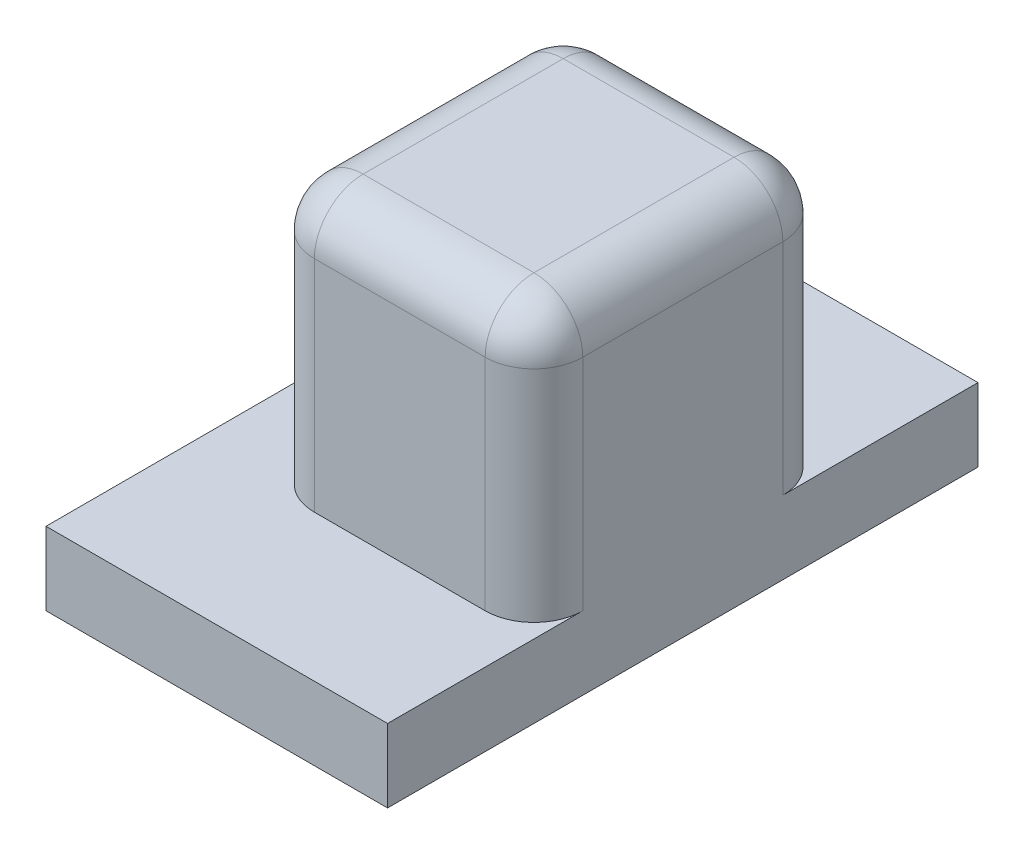
ISO-10303-21;
HEADER;
FILE_DESCRIPTION(('STEP AP214'),'2;1');
FILE_NAME('part.step','',(''),(''),'','','');
FILE_SCHEMA(('AUTOMOTIVE_DESIGN { 1 0 10303 214 1 1 1 1 }'));
ENDSEC;
DATA;
#1=APPLICATION_CONTEXT('core data for automotive mechanical design processes');
#2=APPLICATION_PROTOCOL_DEFINITION('international standard','automotive_design',2000,#1);
#3=PRODUCT_CONTEXT('',#1,'mechanical');
#4=PRODUCT('Part','Part','',(#3));
#5=PRODUCT_RELATED_PRODUCT_CATEGORY('part','',(#4));
#6=PRODUCT_DEFINITION_FORMATION('','',#4);
#7=PRODUCT_DEFINITION_CONTEXT('part definition',#1,'design');
#8=PRODUCT_DEFINITION('design','',#6,#7);
#9=PRODUCT_DEFINITION_SHAPE('','',#8);
#10=(LENGTH_UNIT() NAMED_UNIT(*) SI_UNIT(.MILLI.,.METRE.));
#11=(NAMED_UNIT(*) PLANE_ANGLE_UNIT() SI_UNIT($,.RADIAN.));
#12=(NAMED_UNIT(*) SI_UNIT($,.STERADIAN.) SOLID_ANGLE_UNIT());
#13=UNCERTAINTY_MEASURE_WITH_UNIT(LENGTH_MEASURE(1.E-05),#10,'distance_accuracy_value','');
#14=(GEOMETRIC_REPRESENTATION_CONTEXT(3) GLOBAL_UNCERTAINTY_ASSIGNED_CONTEXT((#13)) GLOBAL_UNIT_ASSIGNED_CONTEXT((#10,
#11,#12)) REPRESENTATION_CONTEXT('',''));
#15=CARTESIAN_POINT('',(0.,0.,0.));
#16=DIRECTION('',(0.,0.,1.));
#17=DIRECTION('',(1.,0.,0.));
#18=AXIS2_PLACEMENT_3D('',#15,#16,#17);
#19=CARTESIAN_POINT('',(1.2,7.,-1.4));
#20=DIRECTION('',(1.,0.,0.));
#21=DIRECTION('',(0.,0.,-1.));
#22=AXIS2_PLACEMENT_3D('',#19,#20,#21);
#23=PLANE('',#22);
#24=DIRECTION('',(0.,-1.,0.));
#25=VECTOR('',#24,1.);
#26=CARTESIAN_POINT('',(1.2,7.,-1.4));
#27=LINE('',#26,#25);
#28=CARTESIAN_POINT('',(1.2,5.5,-1.4));
#29=VERTEX_POINT('',#28);
#30=CARTESIAN_POINT('',(1.2,0.,-1.4));
#31=VERTEX_POINT('',#30);
#32=EDGE_CURVE('E254',#29,#31,#27,.T.);
#33=ORIENTED_EDGE('',*,*,#32,.T.);
#34=DIRECTION('',(0.,0.,1.));
#35=VECTOR('',#34,1.);
#36=CARTESIAN_POINT('',(1.2,0.,-1.4));
#37=LINE('',#36,#35);
#38=CARTESIAN_POINT('',(1.2,0.,-4.7));
#39=VERTEX_POINT('',#38);
#40=EDGE_CURVE('E229',#39,#31,#37,.T.);
#41=ORIENTED_EDGE('',*,*,#40,.F.);
#42=DIRECTION('',(0.,-1.,0.));
#43=VECTOR('',#42,1.);
#44=CARTESIAN_POINT('',(1.2,7.,-4.7));
#45=LINE('',#44,#43);
#46=CARTESIAN_POINT('',(1.2,5.5,-4.7));
#47=VERTEX_POINT('',#46);
#48=EDGE_CURVE('E245',#47,#39,#45,.T.);
#49=ORIENTED_EDGE('',*,*,#48,.F.);
#50=DIRECTION('',(0.,0.,1.));
#51=VECTOR('',#50,1.);
#52=CARTESIAN_POINT('',(1.2,5.5,-1.4));
#53=LINE('',#52,#51);
#54=EDGE_CURVE('E225',#47,#29,#53,.T.);
#55=ORIENTED_EDGE('',*,*,#54,.T.);
#56=EDGE_LOOP('',(#33,#41,#49,#55));
#57=FACE_BOUND('',#56,.T.);
#58=ADVANCED_FACE('F45',(#57),#23,.T.);
#59=CARTESIAN_POINT('',(1.2,7.,-1.4));
#60=DIRECTION('',(0.,0.,-1.));
#61=DIRECTION('',(-1.,0.,0.));
#62=AXIS2_PLACEMENT_3D('',#59,#60,#61);
#63=PLANE('',#62);
#64=DIRECTION('',(0.,-1.,0.));
#65=VECTOR('',#64,1.);
#66=CARTESIAN_POINT('',(4.5,7.,-1.4));
#67=LINE('',#66,#65);
#68=CARTESIAN_POINT('',(4.5,5.5,-1.4));
#69=VERTEX_POINT('',#68);
#70=CARTESIAN_POINT('',(4.5,0.,-1.4));
#71=VERTEX_POINT('',#70);
#72=EDGE_CURVE('E251',#69,#71,#67,.T.);
#73=ORIENTED_EDGE('',*,*,#72,.T.);
#74=DIRECTION('',(1.,0.,0.));
#75=VECTOR('',#74,1.);
#76=CARTESIAN_POINT('',(1.2,0.,-1.4));
#77=LINE('',#76,#75);
#78=EDGE_CURVE('E233',#31,#71,#77,.T.);
#79=ORIENTED_EDGE('',*,*,#78,.F.);
#80=ORIENTED_EDGE('',*,*,#32,.F.);
#81=DIRECTION('',(1.,0.,0.));
#82=VECTOR('',#81,1.);
#83=CARTESIAN_POINT('',(1.2,5.5,-1.4));
#84=LINE('',#83,#82);
#85=EDGE_CURVE('E221',#29,#69,#84,.T.);
#86=ORIENTED_EDGE('',*,*,#85,.T.);
#87=EDGE_LOOP('',(#73,#79,#80,#86));
#88=FACE_BOUND('',#87,.T.);
#89=ADVANCED_FACE('F456',(#88),#63,.T.);
#90=CARTESIAN_POINT('',(4.5,7.,-1.4));
#91=DIRECTION('',(-1.,0.,0.));
#92=DIRECTION('',(0.,0.,1.));
#93=AXIS2_PLACEMENT_3D('',#90,#91,#92);
#94=PLANE('',#93);
#95=DIRECTION('',(0.,-1.,0.));
#96=VECTOR('',#95,1.);
#97=CARTESIAN_POINT('',(4.5,7.,-4.7));
#98=LINE('',#97,#96);
#99=CARTESIAN_POINT('',(4.5,5.5,-4.7));
#100=VERTEX_POINT('',#99);
#101=CARTESIAN_POINT('',(4.5,0.,-4.7));
#102=VERTEX_POINT('',#101);
#103=EDGE_CURVE('E248',#100,#102,#98,.T.);
#104=ORIENTED_EDGE('',*,*,#103,.T.);
#105=DIRECTION('',(0.,0.,-1.));
#106=VECTOR('',#105,1.);
#107=CARTESIAN_POINT('',(4.5,0.,-1.4));
#108=LINE('',#107,#106);
#109=EDGE_CURVE('E237',#71,#102,#108,.T.);
#110=ORIENTED_EDGE('',*,*,#109,.F.);
#111=ORIENTED_EDGE('',*,*,#72,.F.);
#112=DIRECTION('',(0.,0.,-1.));
#113=VECTOR('',#112,1.);
#114=CARTESIAN_POINT('',(4.5,5.5,-1.4));
#115=LINE('',#114,#113);
#116=EDGE_CURVE('E217',#69,#100,#115,.T.);
#117=ORIENTED_EDGE('',*,*,#116,.T.);
#118=EDGE_LOOP('',(#104,#110,#111,#117));
#119=FACE_BOUND('',#118,.T.);
#120=ADVANCED_FACE('F463',(#119),#94,.T.);
#121=CARTESIAN_POINT('',(1.2,7.,-4.7));
#122=DIRECTION('',(0.,0.,1.));
#123=DIRECTION('',(1.,0.,0.));
#124=AXIS2_PLACEMENT_3D('',#121,#122,#123);
#125=PLANE('',#124);
#126=ORIENTED_EDGE('',*,*,#48,.T.);
#127=DIRECTION('',(-1.,0.,0.));
#128=VECTOR('',#127,1.);
#129=CARTESIAN_POINT('',(1.2,0.,-4.7));
#130=LINE('',#129,#128);
#131=EDGE_CURVE('E241',#102,#39,#130,.T.);
#132=ORIENTED_EDGE('',*,*,#131,.F.);
#133=ORIENTED_EDGE('',*,*,#103,.F.);
#134=DIRECTION('',(-1.,0.,0.));
#135=VECTOR('',#134,1.);
#136=CARTESIAN_POINT('',(1.2,5.5,-4.7));
#137=LINE('',#136,#135);
#138=EDGE_CURVE('E260',#100,#47,#137,.T.);
#139=ORIENTED_EDGE('',*,*,#138,.T.);
#140=EDGE_LOOP('',(#126,#132,#133,#139));
#141=FACE_BOUND('',#140,.T.);
#142=ADVANCED_FACE('F470',(#141),#125,.T.);
#143=CARTESIAN_POINT('',(0.,7.,0.));
#144=DIRECTION('',(0.,-1.,0.));
#145=DIRECTION('',(0.,0.,-1.));
#146=AXIS2_PLACEMENT_3D('',#143,#144,#145);
#147=PLANE('',#146);
#148=DIRECTION('',(0.,0.,-1.));
#149=VECTOR('',#148,1.);
#150=CARTESIAN_POINT('',(4.5,7.,0.));
#151=LINE('',#150,#149);
#152=CARTESIAN_POINT('',(4.5,7.,-1.));
#153=VERTEX_POINT('',#152);
#154=CARTESIAN_POINT('',(4.5,7.,-5.1));
#155=VERTEX_POINT('',#154);
#156=EDGE_CURVE('E312',#153,#155,#151,.T.);
#157=ORIENTED_EDGE('',*,*,#156,.T.);
#158=DIRECTION('',(-1.,0.,0.));
#159=VECTOR('',#158,1.);
#160=CARTESIAN_POINT('',(0.,7.,-5.1));
#161=LINE('',#160,#159);
#162=CARTESIAN_POINT('',(1.,7.,-5.1));
#163=VERTEX_POINT('',#162);
#164=EDGE_CURVE('E63',#155,#163,#161,.T.);
#165=ORIENTED_EDGE('',*,*,#164,.T.);
#166=DIRECTION('',(0.,0.,1.));
#167=VECTOR('',#166,1.);
#168=CARTESIAN_POINT('',(1.,7.,0.));
#169=LINE('',#168,#167);
#170=CARTESIAN_POINT('',(1.,7.,-1.));
#171=VERTEX_POINT('',#170);
#172=EDGE_CURVE('E309',#163,#171,#169,.T.);
#173=ORIENTED_EDGE('',*,*,#172,.T.);
#174=DIRECTION('',(1.,0.,0.));
#175=VECTOR('',#174,1.);
#176=CARTESIAN_POINT('',(0.,7.,-1.));
#177=LINE('',#176,#175);
#178=EDGE_CURVE('E306',#171,#153,#177,.T.);
#179=ORIENTED_EDGE('',*,*,#178,.T.);
#180=EDGE_LOOP('',(#157,#165,#173,#179));
#181=FACE_BOUND('',#180,.T.);
#182=ADVANCED_FACE('F443',(#181),#147,.F.);
#183=CARTESIAN_POINT('',(0.,0.,0.));
#184=DIRECTION('',(0.,-1.,0.));
#185=DIRECTION('',(0.,0.,-1.));
#186=AXIS2_PLACEMENT_3D('',#183,#184,#185);
#187=PLANE('',#186);
#188=DIRECTION('',(0.,0.,-1.));
#189=VECTOR('',#188,1.);
#190=CARTESIAN_POINT('',(5.5,0.,0.));
#191=LINE('',#190,#189);
#192=CARTESIAN_POINT('',(5.5,0.,3.));
#193=VERTEX_POINT('',#192);
#194=CARTESIAN_POINT('',(5.5,0.,-9.1));
#195=VERTEX_POINT('',#194);
#196=EDGE_CURVE('E257',#193,#195,#191,.T.);
#197=ORIENTED_EDGE('',*,*,#196,.F.);
#198=DIRECTION('',(1.,0.,0.));
#199=VECTOR('',#198,1.);
#200=CARTESIAN_POINT('',(-1.5,0.,3.));
#201=LINE('',#200,#199);
#202=CARTESIAN_POINT('',(-1.5,0.,3.));
#203=VERTEX_POINT('',#202);
#204=EDGE_CURVE('E376',#203,#193,#201,.T.);
#205=ORIENTED_EDGE('',*,*,#204,.F.);
#206=DIRECTION('',(0.,0.,1.));
#207=VECTOR('',#206,1.);
#208=CARTESIAN_POINT('',(-1.5,0.,-9.1));
#209=LINE('',#208,#207);
#210=CARTESIAN_POINT('',(-1.5,0.,-9.1));
#211=VERTEX_POINT('',#210);
#212=EDGE_CURVE('E201',#211,#203,#209,.T.);
#213=ORIENTED_EDGE('',*,*,#212,.F.);
#214=DIRECTION('',(-1.,0.,0.));
#215=VECTOR('',#214,1.);
#216=CARTESIAN_POINT('',(-1.5,0.,-9.1));
#217=LINE('',#216,#215);
#218=EDGE_CURVE('E197',#195,#211,#217,.T.);
#219=ORIENTED_EDGE('',*,*,#218,.F.);
#220=EDGE_LOOP('',(#197,#205,#213,#219));
#221=FACE_BOUND('',#220,.T.);
#222=ORIENTED_EDGE('',*,*,#131,.T.);
#223=ORIENTED_EDGE('',*,*,#40,.T.);
#224=ORIENTED_EDGE('',*,*,#78,.T.);
#225=ORIENTED_EDGE('',*,*,#109,.T.);
#226=EDGE_LOOP('',(#222,#223,#224,#225));
#227=FACE_BOUND('',#226,.T.);
#228=ADVANCED_FACE('F395',(#221,#227),#187,.T.);
#229=CARTESIAN_POINT('',(0.,7.,0.));
#230=DIRECTION('',(1.,0.,0.));
#231=DIRECTION('',(0.,0.,-1.));
#232=AXIS2_PLACEMENT_3D('',#229,#230,#231);
#233=PLANE('',#232);
#234=DIRECTION('',(0.,0.,1.));
#235=VECTOR('',#234,1.);
#236=CARTESIAN_POINT('',(0.,6.,0.));
#237=LINE('',#236,#235);
#238=CARTESIAN_POINT('',(0.,6.,-1.));
#239=VERTEX_POINT('',#238);
#240=CARTESIAN_POINT('',(0.,6.,-5.1));
#241=VERTEX_POINT('',#240);
#242=EDGE_CURVE('E268',#239,#241,#237,.F.);
#243=ORIENTED_EDGE('',*,*,#242,.T.);
#244=DIRECTION('',(0.,-1.,0.));
#245=VECTOR('',#244,1.);
#246=CARTESIAN_POINT('',(0.,7.,-5.1));
#247=LINE('',#246,#245);
#248=CARTESIAN_POINT('',(0.,1.5,-5.1));
#249=VERTEX_POINT('',#248);
#250=EDGE_CURVE('E274',#241,#249,#247,.T.);
#251=ORIENTED_EDGE('',*,*,#250,.T.);
#252=DIRECTION('',(0.,0.,1.));
#253=VECTOR('',#252,1.);
#254=CARTESIAN_POINT('',(0.,1.5,0.));
#255=LINE('',#254,#253);
#256=CARTESIAN_POINT('',(0.,1.5,-1.));
#257=VERTEX_POINT('',#256);
#258=EDGE_CURVE('E203',#249,#257,#255,.T.);
#259=ORIENTED_EDGE('',*,*,#258,.T.);
#260=DIRECTION('',(0.,-1.,0.));
#261=VECTOR('',#260,1.);
#262=CARTESIAN_POINT('',(0.,7.,-1.));
#263=LINE('',#262,#261);
#264=EDGE_CURVE('E271',#257,#239,#263,.F.);
#265=ORIENTED_EDGE('',*,*,#264,.T.);
#266=EDGE_LOOP('',(#243,#251,#259,#265));
#267=FACE_BOUND('',#266,.T.);
#268=ADVANCED_FACE('F428',(#267),#233,.F.);
#269=CARTESIAN_POINT('',(0.,7.,0.));
#270=DIRECTION('',(0.,0.,-1.));
#271=DIRECTION('',(-1.,0.,0.));
#272=AXIS2_PLACEMENT_3D('',#269,#270,#271);
#273=PLANE('',#272);
#274=DIRECTION('',(1.,0.,0.));
#275=VECTOR('',#274,1.);
#276=CARTESIAN_POINT('',(0.,6.,0.));
#277=LINE('',#276,#275);
#278=CARTESIAN_POINT('',(4.5,6.,0.));
#279=VERTEX_POINT('',#278);
#280=CARTESIAN_POINT('',(1.,6.,0.));
#281=VERTEX_POINT('',#280);
#282=EDGE_CURVE('E287',#279,#281,#277,.F.);
#283=ORIENTED_EDGE('',*,*,#282,.T.);
#284=DIRECTION('',(0.,-1.,0.));
#285=VECTOR('',#284,1.);
#286=CARTESIAN_POINT('',(1.,7.,0.));
#287=LINE('',#286,#285);
#288=CARTESIAN_POINT('',(1.,1.5,0.));
#289=VERTEX_POINT('',#288);
#290=EDGE_CURVE('E293',#281,#289,#287,.T.);
#291=ORIENTED_EDGE('',*,*,#290,.T.);
#292=DIRECTION('',(1.,0.,0.));
#293=VECTOR('',#292,1.);
#294=CARTESIAN_POINT('',(0.,1.5,0.));
#295=LINE('',#294,#293);
#296=CARTESIAN_POINT('',(4.5,1.5,0.));
#297=VERTEX_POINT('',#296);
#298=EDGE_CURVE('E208',#289,#297,#295,.T.);
#299=ORIENTED_EDGE('',*,*,#298,.T.);
#300=DIRECTION('',(0.,-1.,0.));
#301=VECTOR('',#300,1.);
#302=CARTESIAN_POINT('',(4.5,7.,0.));
#303=LINE('',#302,#301);
#304=EDGE_CURVE('E290',#297,#279,#303,.F.);
#305=ORIENTED_EDGE('',*,*,#304,.T.);
#306=EDGE_LOOP('',(#283,#291,#299,#305));
#307=FACE_BOUND('',#306,.T.);
#308=ADVANCED_FACE('F479',(#307),#273,.F.);
#309=CARTESIAN_POINT('',(5.5,7.,0.));
#310=DIRECTION('',(-1.,0.,0.));
#311=DIRECTION('',(0.,0.,1.));
#312=AXIS2_PLACEMENT_3D('',#309,#310,#311);
#313=PLANE('',#312);
#314=DIRECTION('',(0.,-1.,0.));
#315=VECTOR('',#314,1.);
#316=CARTESIAN_POINT('',(5.5,7.,-1.));
#317=LINE('',#316,#315);
#318=CARTESIAN_POINT('',(5.5,6.,-1.));
#319=VERTEX_POINT('',#318);
#320=CARTESIAN_POINT('',(5.5,1.5,-1.));
#321=VERTEX_POINT('',#320);
#322=EDGE_CURVE('E302',#319,#321,#317,.T.);
#323=ORIENTED_EDGE('',*,*,#322,.T.);
#324=DIRECTION('',(0.,0.,-1.));
#325=VECTOR('',#324,1.);
#326=CARTESIAN_POINT('',(5.5,1.5,-9.1));
#327=LINE('',#326,#325);
#328=CARTESIAN_POINT('',(5.5,1.5,3.));
#329=VERTEX_POINT('',#328);
#330=EDGE_CURVE('E398',#329,#321,#327,.T.);
#331=ORIENTED_EDGE('',*,*,#330,.F.);
#332=DIRECTION('',(0.,-1.,0.));
#333=VECTOR('',#332,1.);
#334=CARTESIAN_POINT('',(5.5,1.5,3.));
#335=LINE('',#334,#333);
#336=EDGE_CURVE('E181',#329,#193,#335,.T.);
#337=ORIENTED_EDGE('',*,*,#336,.T.);
#338=ORIENTED_EDGE('',*,*,#196,.T.);
#339=DIRECTION('',(0.,-1.,0.));
#340=VECTOR('',#339,1.);
#341=CARTESIAN_POINT('',(5.5,1.5,-9.1));
#342=LINE('',#341,#340);
#343=CARTESIAN_POINT('',(5.5,1.5,-9.1));
#344=VERTEX_POINT('',#343);
#345=EDGE_CURVE('E210',#344,#195,#342,.T.);
#346=ORIENTED_EDGE('',*,*,#345,.F.);
#347=CARTESIAN_POINT('',(5.5,1.5,-5.1));
#348=VERTEX_POINT('',#347);
#349=EDGE_CURVE('E185',#348,#344,#327,.T.);
#350=ORIENTED_EDGE('',*,*,#349,.F.);
#351=DIRECTION('',(0.,-1.,0.));
#352=VECTOR('',#351,1.);
#353=CARTESIAN_POINT('',(5.5,7.,-5.1));
#354=LINE('',#353,#352);
#355=CARTESIAN_POINT('',(5.5,6.,-5.1));
#356=VERTEX_POINT('',#355);
#357=EDGE_CURVE('E299',#348,#356,#354,.F.);
#358=ORIENTED_EDGE('',*,*,#357,.T.);
#359=DIRECTION('',(0.,0.,-1.));
#360=VECTOR('',#359,1.);
#361=CARTESIAN_POINT('',(5.5,6.,0.));
#362=LINE('',#361,#360);
#363=EDGE_CURVE('E296',#356,#319,#362,.F.);
#364=ORIENTED_EDGE('',*,*,#363,.T.);
#365=EDGE_LOOP('',(#323,#331,#337,#338,#346,#350,#358,#364));
#366=FACE_BOUND('',#365,.T.);
#367=ADVANCED_FACE('F397',(#366),#313,.F.);
#368=CARTESIAN_POINT('',(0.,7.,-6.1));
#369=DIRECTION('',(0.,0.,1.));
#370=DIRECTION('',(1.,0.,0.));
#371=AXIS2_PLACEMENT_3D('',#368,#369,#370);
#372=PLANE('',#371);
#373=DIRECTION('',(-1.,0.,0.));
#374=VECTOR('',#373,1.);
#375=CARTESIAN_POINT('',(0.,1.5,-6.1));
#376=LINE('',#375,#374);
#377=CARTESIAN_POINT('',(4.5,1.5,-6.1));
#378=VERTEX_POINT('',#377);
#379=CARTESIAN_POINT('',(1.,1.5,-6.1));
#380=VERTEX_POINT('',#379);
#381=EDGE_CURVE('E264',#378,#380,#376,.T.);
#382=ORIENTED_EDGE('',*,*,#381,.T.);
#383=DIRECTION('',(0.,-1.,0.));
#384=VECTOR('',#383,1.);
#385=CARTESIAN_POINT('',(1.,7.,-6.1));
#386=LINE('',#385,#384);
#387=CARTESIAN_POINT('',(1.,6.,-6.1));
#388=VERTEX_POINT('',#387);
#389=EDGE_CURVE('E284',#380,#388,#386,.F.);
#390=ORIENTED_EDGE('',*,*,#389,.T.);
#391=DIRECTION('',(-1.,0.,0.));
#392=VECTOR('',#391,1.);
#393=CARTESIAN_POINT('',(0.,6.,-6.1));
#394=LINE('',#393,#392);
#395=CARTESIAN_POINT('',(4.5,6.,-6.1));
#396=VERTEX_POINT('',#395);
#397=EDGE_CURVE('E278',#388,#396,#394,.F.);
#398=ORIENTED_EDGE('',*,*,#397,.T.);
#399=DIRECTION('',(0.,-1.,0.));
#400=VECTOR('',#399,1.);
#401=CARTESIAN_POINT('',(4.5,7.,-6.1));
#402=LINE('',#401,#400);
#403=EDGE_CURVE('E281',#396,#378,#402,.T.);
#404=ORIENTED_EDGE('',*,*,#403,.T.);
#405=EDGE_LOOP('',(#382,#390,#398,#404));
#406=FACE_BOUND('',#405,.T.);
#407=ADVANCED_FACE('F473',(#406),#372,.F.);
#408=CARTESIAN_POINT('',(0.,5.5,0.));
#409=DIRECTION('',(0.,1.,0.));
#410=DIRECTION('',(0.,0.,1.));
#411=AXIS2_PLACEMENT_3D('',#408,#409,#410);
#412=PLANE('',#411);
#413=ORIENTED_EDGE('',*,*,#54,.F.);
#414=ORIENTED_EDGE('',*,*,#138,.F.);
#415=ORIENTED_EDGE('',*,*,#116,.F.);
#416=ORIENTED_EDGE('',*,*,#85,.F.);
#417=EDGE_LOOP('',(#413,#414,#415,#416));
#418=FACE_BOUND('',#417,.T.);
#419=ADVANCED_FACE('F476',(#418),#412,.F.);
#420=CARTESIAN_POINT('',(0.,1.5,0.));
#421=DIRECTION('',(0.,1.,0.));
#422=DIRECTION('',(0.,0.,1.));
#423=AXIS2_PLACEMENT_3D('',#420,#421,#422);
#424=PLANE('',#423);
#425=ORIENTED_EDGE('',*,*,#298,.F.);
#426=CARTESIAN_POINT('',(1.,1.5,-1.));
#427=DIRECTION('',(0.,1.,0.));
#428=DIRECTION('',(0.,0.,1.));
#429=AXIS2_PLACEMENT_3D('',#426,#427,#428);
#430=CIRCLE('',#429,1.);
#431=EDGE_CURVE('E320',#289,#257,#430,.F.);
#432=ORIENTED_EDGE('',*,*,#431,.T.);
#433=ORIENTED_EDGE('',*,*,#258,.F.);
#434=CARTESIAN_POINT('',(1.,1.5,-5.1));
#435=DIRECTION('',(0.,1.,0.));
#436=DIRECTION('',(0.,0.,1.));
#437=AXIS2_PLACEMENT_3D('',#434,#435,#436);
#438=CIRCLE('',#437,1.);
#439=EDGE_CURVE('E317',#249,#380,#438,.F.);
#440=ORIENTED_EDGE('',*,*,#439,.T.);
#441=ORIENTED_EDGE('',*,*,#381,.F.);
#442=CARTESIAN_POINT('',(4.5,1.5,-5.1));
#443=DIRECTION('',(0.,1.,0.));
#444=DIRECTION('',(0.,0.,1.));
#445=AXIS2_PLACEMENT_3D('',#442,#443,#444);
#446=CIRCLE('',#445,1.);
#447=EDGE_CURVE('E11',#378,#348,#446,.F.);
#448=ORIENTED_EDGE('',*,*,#447,.T.);
#449=ORIENTED_EDGE('',*,*,#349,.T.);
#450=DIRECTION('',(-1.,0.,0.));
#451=VECTOR('',#450,1.);
#452=CARTESIAN_POINT('',(-1.5,1.5,-9.1));
#453=LINE('',#452,#451);
#454=CARTESIAN_POINT('',(-1.5,1.5,-9.1));
#455=VERTEX_POINT('',#454);
#456=EDGE_CURVE('E192',#344,#455,#453,.T.);
#457=ORIENTED_EDGE('',*,*,#456,.T.);
#458=DIRECTION('',(0.,0.,1.));
#459=VECTOR('',#458,1.);
#460=CARTESIAN_POINT('',(-1.5,1.5,-9.1));
#461=LINE('',#460,#459);
#462=CARTESIAN_POINT('',(-1.5,1.5,3.));
#463=VERTEX_POINT('',#462);
#464=EDGE_CURVE('E186',#455,#463,#461,.T.);
#465=ORIENTED_EDGE('',*,*,#464,.T.);
#466=DIRECTION('',(1.,0.,0.));
#467=VECTOR('',#466,1.);
#468=CARTESIAN_POINT('',(-1.5,1.5,3.));
#469=LINE('',#468,#467);
#470=EDGE_CURVE('E173',#463,#329,#469,.T.);
#471=ORIENTED_EDGE('',*,*,#470,.T.);
#472=ORIENTED_EDGE('',*,*,#330,.T.);
#473=CARTESIAN_POINT('',(4.5,1.5,-1.));
#474=DIRECTION('',(0.,1.,0.));
#475=DIRECTION('',(0.,0.,1.));
#476=AXIS2_PLACEMENT_3D('',#473,#474,#475);
#477=CIRCLE('',#476,1.);
#478=EDGE_CURVE('E55',#321,#297,#477,.F.);
#479=ORIENTED_EDGE('',*,*,#478,.T.);
#480=EDGE_LOOP('',(#425,#432,#433,#440,#441,#448,#449,#457,#465,#471,#472,#479));
#481=FACE_BOUND('',#480,.T.);
#482=ADVANCED_FACE('F190',(#481),#424,.T.);
#483=CARTESIAN_POINT('',(-1.5,1.5,-9.1));
#484=DIRECTION('',(1.,0.,0.));
#485=DIRECTION('',(0.,0.,-1.));
#486=AXIS2_PLACEMENT_3D('',#483,#484,#485);
#487=PLANE('',#486);
#488=ORIENTED_EDGE('',*,*,#212,.T.);
#489=DIRECTION('',(0.,-1.,0.));
#490=VECTOR('',#489,1.);
#491=CARTESIAN_POINT('',(-1.5,1.5,3.));
#492=LINE('',#491,#490);
#493=EDGE_CURVE('E178',#463,#203,#492,.T.);
#494=ORIENTED_EDGE('',*,*,#493,.F.);
#495=ORIENTED_EDGE('',*,*,#464,.F.);
#496=DIRECTION('',(0.,-1.,0.));
#497=VECTOR('',#496,1.);
#498=CARTESIAN_POINT('',(-1.5,1.5,-9.1));
#499=LINE('',#498,#497);
#500=EDGE_CURVE('E385',#455,#211,#499,.T.);
#501=ORIENTED_EDGE('',*,*,#500,.T.);
#502=EDGE_LOOP('',(#488,#494,#495,#501));
#503=FACE_BOUND('',#502,.T.);
#504=ADVANCED_FACE('F199',(#503),#487,.F.);
#505=CARTESIAN_POINT('',(-1.5,1.5,3.));
#506=DIRECTION('',(0.,0.,-1.));
#507=DIRECTION('',(-1.,0.,0.));
#508=AXIS2_PLACEMENT_3D('',#505,#506,#507);
#509=PLANE('',#508);
#510=ORIENTED_EDGE('',*,*,#204,.T.);
#511=ORIENTED_EDGE('',*,*,#336,.F.);
#512=ORIENTED_EDGE('',*,*,#470,.F.);
#513=ORIENTED_EDGE('',*,*,#493,.T.);
#514=EDGE_LOOP('',(#510,#511,#512,#513));
#515=FACE_BOUND('',#514,.T.);
#516=ADVANCED_FACE('F176',(#515),#509,.F.);
#517=CARTESIAN_POINT('',(-1.5,1.5,-9.1));
#518=DIRECTION('',(0.,0.,1.));
#519=DIRECTION('',(1.,0.,0.));
#520=AXIS2_PLACEMENT_3D('',#517,#518,#519);
#521=PLANE('',#520);
#522=ORIENTED_EDGE('',*,*,#218,.T.);
#523=ORIENTED_EDGE('',*,*,#500,.F.);
#524=ORIENTED_EDGE('',*,*,#456,.F.);
#525=ORIENTED_EDGE('',*,*,#345,.T.);
#526=EDGE_LOOP('',(#522,#523,#524,#525));
#527=FACE_BOUND('',#526,.T.);
#528=ADVANCED_FACE('F392',(#527),#521,.F.);
#529=CARTESIAN_POINT('',(4.5,7.,-1.));
#530=DIRECTION('',(0.,-1.,0.));
#531=DIRECTION('',(0.,0.,-1.));
#532=AXIS2_PLACEMENT_3D('',#529,#530,#531);
#533=CYLINDRICAL_SURFACE('',#532,1.);
#534=CARTESIAN_POINT('',(4.5,6.,-1.));
#535=DIRECTION('',(0.,1.,0.));
#536=DIRECTION('',(0.,0.,1.));
#537=AXIS2_PLACEMENT_3D('',#534,#535,#536);
#538=CIRCLE('',#537,1.);
#539=EDGE_CURVE('E49',#279,#319,#538,.T.);
#540=ORIENTED_EDGE('',*,*,#539,.F.);
#541=ORIENTED_EDGE('',*,*,#304,.F.);
#542=ORIENTED_EDGE('',*,*,#478,.F.);
#543=ORIENTED_EDGE('',*,*,#322,.F.);
#544=EDGE_LOOP('',(#540,#541,#542,#543));
#545=FACE_BOUND('',#544,.T.);
#546=ADVANCED_FACE('F47',(#545),#533,.T.);
#547=CARTESIAN_POINT('',(4.5,6.,-1.));
#548=DIRECTION('',(1.,0.,0.));
#549=DIRECTION('',(0.,0.,-1.));
#550=AXIS2_PLACEMENT_3D('',#547,#548,#549);
#551=SPHERICAL_SURFACE('',#550,1.);
#552=CARTESIAN_POINT('',(4.5,6.,-1.));
#553=DIRECTION('',(1.,0.,0.));
#554=DIRECTION('',(0.,0.,-1.));
#555=AXIS2_PLACEMENT_3D('',#552,#553,#554);
#556=CIRCLE('',#555,1.);
#557=EDGE_CURVE('E360',#279,#153,#556,.F.);
#558=ORIENTED_EDGE('',*,*,#557,.F.);
#559=ORIENTED_EDGE('',*,*,#539,.T.);
#560=CARTESIAN_POINT('',(4.5,6.,-1.));
#561=DIRECTION('',(0.,0.,1.));
#562=DIRECTION('',(1.,0.,0.));
#563=AXIS2_PLACEMENT_3D('',#560,#561,#562);
#564=CIRCLE('',#563,1.);
#565=EDGE_CURVE('E363',#153,#319,#564,.F.);
#566=ORIENTED_EDGE('',*,*,#565,.F.);
#567=EDGE_LOOP('',(#558,#559,#566));
#568=FACE_BOUND('',#567,.T.);
#569=ADVANCED_FACE('F447',(#568),#551,.T.);
#570=CARTESIAN_POINT('',(4.5,7.,-5.1));
#571=DIRECTION('',(0.,-1.,0.));
#572=DIRECTION('',(0.,0.,-1.));
#573=AXIS2_PLACEMENT_3D('',#570,#571,#572);
#574=CYLINDRICAL_SURFACE('',#573,1.);
#575=ORIENTED_EDGE('',*,*,#447,.F.);
#576=ORIENTED_EDGE('',*,*,#403,.F.);
#577=CARTESIAN_POINT('',(4.5,6.,-5.1));
#578=DIRECTION('',(0.,1.,0.));
#579=DIRECTION('',(0.,0.,1.));
#580=AXIS2_PLACEMENT_3D('',#577,#578,#579);
#581=CIRCLE('',#580,1.);
#582=EDGE_CURVE('E356',#356,#396,#581,.T.);
#583=ORIENTED_EDGE('',*,*,#582,.F.);
#584=ORIENTED_EDGE('',*,*,#357,.F.);
#585=EDGE_LOOP('',(#575,#576,#583,#584));
#586=FACE_BOUND('',#585,.T.);
#587=ADVANCED_FACE('F412',(#586),#574,.T.);
#588=CARTESIAN_POINT('',(4.5,6.,0.));
#589=DIRECTION('',(0.,0.,-1.));
#590=DIRECTION('',(-1.,0.,0.));
#591=AXIS2_PLACEMENT_3D('',#588,#589,#590);
#592=CYLINDRICAL_SURFACE('',#591,1.);
#593=ORIENTED_EDGE('',*,*,#565,.T.);
#594=ORIENTED_EDGE('',*,*,#363,.F.);
#595=CARTESIAN_POINT('',(4.5,6.,-5.1));
#596=DIRECTION('',(0.,0.,-1.));
#597=DIRECTION('',(-1.,0.,0.));
#598=AXIS2_PLACEMENT_3D('',#595,#596,#597);
#599=CIRCLE('',#598,1.);
#600=EDGE_CURVE('E352',#155,#356,#599,.T.);
#601=ORIENTED_EDGE('',*,*,#600,.F.);
#602=ORIENTED_EDGE('',*,*,#156,.F.);
#603=EDGE_LOOP('',(#593,#594,#601,#602));
#604=FACE_BOUND('',#603,.T.);
#605=ADVANCED_FACE('F410',(#604),#592,.T.);
#606=CARTESIAN_POINT('',(0.,6.,-1.));
#607=DIRECTION('',(1.,0.,0.));
#608=DIRECTION('',(0.,0.,-1.));
#609=AXIS2_PLACEMENT_3D('',#606,#607,#608);
#610=CYLINDRICAL_SURFACE('',#609,1.);
#611=ORIENTED_EDGE('',*,*,#557,.T.);
#612=ORIENTED_EDGE('',*,*,#178,.F.);
#613=CARTESIAN_POINT('',(1.,6.,-1.));
#614=DIRECTION('',(-1.,0.,0.));
#615=DIRECTION('',(0.,0.,1.));
#616=AXIS2_PLACEMENT_3D('',#613,#614,#615);
#617=CIRCLE('',#616,1.);
#618=EDGE_CURVE('E348',#281,#171,#617,.T.);
#619=ORIENTED_EDGE('',*,*,#618,.F.);
#620=ORIENTED_EDGE('',*,*,#282,.F.);
#621=EDGE_LOOP('',(#611,#612,#619,#620));
#622=FACE_BOUND('',#621,.T.);
#623=ADVANCED_FACE('F445',(#622),#610,.T.);
#624=CARTESIAN_POINT('',(1.,7.,-1.));
#625=DIRECTION('',(0.,-1.,0.));
#626=DIRECTION('',(0.,0.,-1.));
#627=AXIS2_PLACEMENT_3D('',#624,#625,#626);
#628=CYLINDRICAL_SURFACE('',#627,1.);
#629=ORIENTED_EDGE('',*,*,#431,.F.);
#630=ORIENTED_EDGE('',*,*,#290,.F.);
#631=CARTESIAN_POINT('',(1.,6.,-1.));
#632=DIRECTION('',(0.,1.,0.));
#633=DIRECTION('',(0.,0.,1.));
#634=AXIS2_PLACEMENT_3D('',#631,#632,#633);
#635=CIRCLE('',#634,1.);
#636=EDGE_CURVE('E344',#239,#281,#635,.T.);
#637=ORIENTED_EDGE('',*,*,#636,.F.);
#638=ORIENTED_EDGE('',*,*,#264,.F.);
#639=EDGE_LOOP('',(#629,#630,#637,#638));
#640=FACE_BOUND('',#639,.T.);
#641=ADVANCED_FACE('F434',(#640),#628,.T.);
#642=CARTESIAN_POINT('',(4.5,6.,-5.1));
#643=DIRECTION('',(1.,0.,0.));
#644=DIRECTION('',(0.,0.,-1.));
#645=AXIS2_PLACEMENT_3D('',#642,#643,#644);
#646=SPHERICAL_SURFACE('',#645,1.);
#647=ORIENTED_EDGE('',*,*,#600,.T.);
#648=ORIENTED_EDGE('',*,*,#582,.T.);
#649=CARTESIAN_POINT('',(4.5,6.,-5.1));
#650=DIRECTION('',(1.,0.,0.));
#651=DIRECTION('',(0.,0.,-1.));
#652=AXIS2_PLACEMENT_3D('',#649,#650,#651);
#653=CIRCLE('',#652,1.);
#654=EDGE_CURVE('E341',#155,#396,#653,.F.);
#655=ORIENTED_EDGE('',*,*,#654,.F.);
#656=EDGE_LOOP('',(#647,#648,#655));
#657=FACE_BOUND('',#656,.T.);
#658=ADVANCED_FACE('F414',(#657),#646,.T.);
#659=CARTESIAN_POINT('',(1.,6.,-1.));
#660=DIRECTION('',(0.,0.,1.));
#661=DIRECTION('',(1.,0.,0.));
#662=AXIS2_PLACEMENT_3D('',#659,#660,#661);
#663=SPHERICAL_SURFACE('',#662,1.);
#664=ORIENTED_EDGE('',*,*,#636,.T.);
#665=ORIENTED_EDGE('',*,*,#618,.T.);
#666=CARTESIAN_POINT('',(1.,6.,-1.));
#667=DIRECTION('',(0.,0.,1.));
#668=DIRECTION('',(1.,0.,0.));
#669=AXIS2_PLACEMENT_3D('',#666,#667,#668);
#670=CIRCLE('',#669,1.);
#671=EDGE_CURVE('E337',#239,#171,#670,.F.);
#672=ORIENTED_EDGE('',*,*,#671,.F.);
#673=EDGE_LOOP('',(#664,#665,#672));
#674=FACE_BOUND('',#673,.T.);
#675=ADVANCED_FACE('F439',(#674),#663,.T.);
#676=CARTESIAN_POINT('',(0.,6.,-5.1));
#677=DIRECTION('',(-1.,0.,0.));
#678=DIRECTION('',(0.,0.,1.));
#679=AXIS2_PLACEMENT_3D('',#676,#677,#678);
#680=CYLINDRICAL_SURFACE('',#679,1.);
#681=ORIENTED_EDGE('',*,*,#654,.T.);
#682=ORIENTED_EDGE('',*,*,#397,.F.);
#683=CARTESIAN_POINT('',(1.,6.,-5.1));
#684=DIRECTION('',(-1.,0.,0.));
#685=DIRECTION('',(0.,0.,1.));
#686=AXIS2_PLACEMENT_3D('',#683,#684,#685);
#687=CIRCLE('',#686,1.);
#688=EDGE_CURVE('E333',#163,#388,#687,.T.);
#689=ORIENTED_EDGE('',*,*,#688,.F.);
#690=ORIENTED_EDGE('',*,*,#164,.F.);
#691=EDGE_LOOP('',(#681,#682,#689,#690));
#692=FACE_BOUND('',#691,.T.);
#693=ADVANCED_FACE('F416',(#692),#680,.T.);
#694=CARTESIAN_POINT('',(1.,6.,0.));
#695=DIRECTION('',(0.,0.,1.));
#696=DIRECTION('',(1.,0.,0.));
#697=AXIS2_PLACEMENT_3D('',#694,#695,#696);
#698=CYLINDRICAL_SURFACE('',#697,1.);
#699=ORIENTED_EDGE('',*,*,#671,.T.);
#700=ORIENTED_EDGE('',*,*,#172,.F.);
#701=CARTESIAN_POINT('',(1.,6.,-5.1));
#702=DIRECTION('',(0.,0.,-1.));
#703=DIRECTION('',(-1.,0.,0.));
#704=AXIS2_PLACEMENT_3D('',#701,#702,#703);
#705=CIRCLE('',#704,1.);
#706=EDGE_CURVE('E329',#241,#163,#705,.T.);
#707=ORIENTED_EDGE('',*,*,#706,.F.);
#708=ORIENTED_EDGE('',*,*,#242,.F.);
#709=EDGE_LOOP('',(#699,#700,#707,#708));
#710=FACE_BOUND('',#709,.T.);
#711=ADVANCED_FACE('F441',(#710),#698,.T.);
#712=CARTESIAN_POINT('',(1.,6.,-5.1));
#713=DIRECTION('',(0.,1.,0.));
#714=DIRECTION('',(0.,0.,1.));
#715=AXIS2_PLACEMENT_3D('',#712,#713,#714);
#716=SPHERICAL_SURFACE('',#715,1.);
#717=ORIENTED_EDGE('',*,*,#706,.T.);
#718=ORIENTED_EDGE('',*,*,#688,.T.);
#719=CARTESIAN_POINT('',(1.,6.,-5.1));
#720=DIRECTION('',(0.,1.,0.));
#721=DIRECTION('',(0.,0.,1.));
#722=AXIS2_PLACEMENT_3D('',#719,#720,#721);
#723=CIRCLE('',#722,1.);
#724=EDGE_CURVE('E325',#241,#388,#723,.F.);
#725=ORIENTED_EDGE('',*,*,#724,.F.);
#726=EDGE_LOOP('',(#717,#718,#725));
#727=FACE_BOUND('',#726,.T.);
#728=ADVANCED_FACE('F420',(#727),#716,.T.);
#729=CARTESIAN_POINT('',(1.,7.,-5.1));
#730=DIRECTION('',(0.,-1.,0.));
#731=DIRECTION('',(0.,0.,-1.));
#732=AXIS2_PLACEMENT_3D('',#729,#730,#731);
#733=CYLINDRICAL_SURFACE('',#732,1.);
#734=ORIENTED_EDGE('',*,*,#724,.T.);
#735=ORIENTED_EDGE('',*,*,#389,.F.);
#736=ORIENTED_EDGE('',*,*,#439,.F.);
#737=ORIENTED_EDGE('',*,*,#250,.F.);
#738=EDGE_LOOP('',(#734,#735,#736,#737));
#739=FACE_BOUND('',#738,.T.);
#740=ADVANCED_FACE('F425',(#739),#733,.T.);
#741=CLOSED_SHELL('',(#58,#89,#120,#142,#182,#228,#268,#308,#367,#407,#419,#482,#504,#516,#528,
#546,#569,#587,#605,#623,#641,#658,#675,#693,#711,#728,#740));
#742=MANIFOLD_SOLID_BREP('B2',#741);
#743=ADVANCED_BREP_SHAPE_REPRESENTATION('',(#18,#742),#14);
#744=SHAPE_DEFINITION_REPRESENTATION(#9,#743);
ENDSEC;
END-ISO-10303-21;
